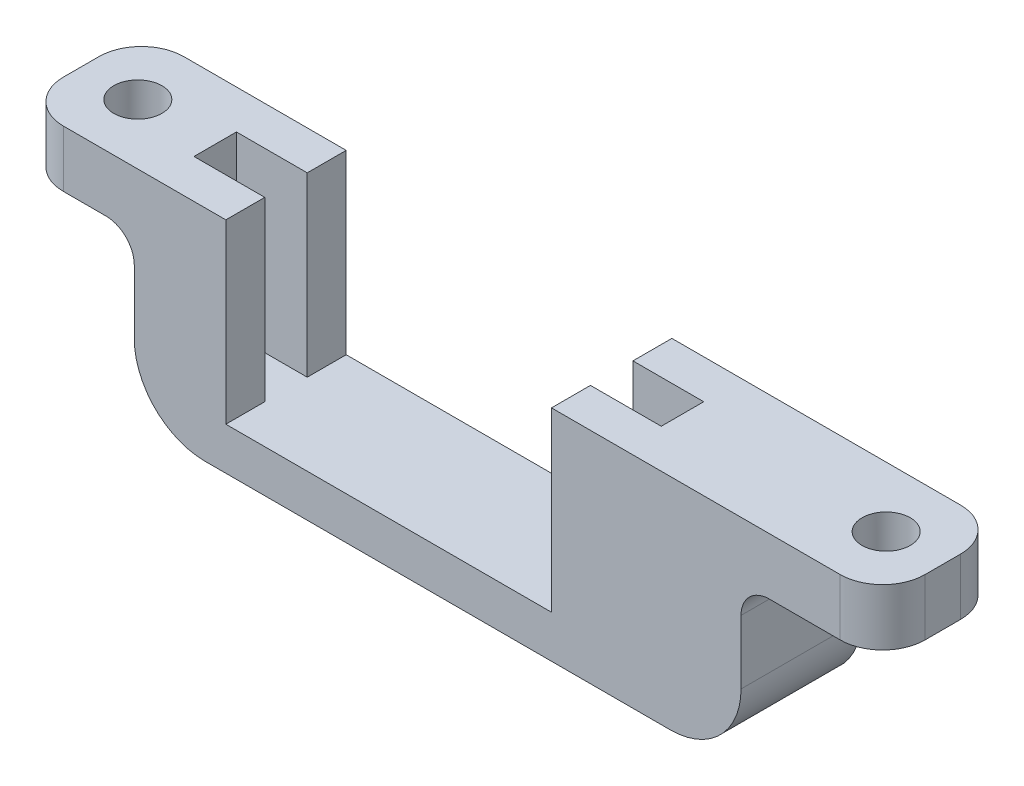
ISO-10303-21;
HEADER;
FILE_DESCRIPTION(('STEP AP214'),'2;1');
FILE_NAME('part.step','',(''),(''),'','','');
FILE_SCHEMA(('AUTOMOTIVE_DESIGN { 1 0 10303 214 1 1 1 1 }'));
ENDSEC;
DATA;
#1=APPLICATION_CONTEXT('core data for automotive mechanical design processes');
#2=APPLICATION_PROTOCOL_DEFINITION('international standard','automotive_design',2000,#1);
#3=PRODUCT_CONTEXT('',#1,'mechanical');
#4=PRODUCT('Part','Part','',(#3));
#5=PRODUCT_RELATED_PRODUCT_CATEGORY('part','',(#4));
#6=PRODUCT_DEFINITION_FORMATION('','',#4);
#7=PRODUCT_DEFINITION_CONTEXT('part definition',#1,'design');
#8=PRODUCT_DEFINITION('design','',#6,#7);
#9=PRODUCT_DEFINITION_SHAPE('','',#8);
#10=(LENGTH_UNIT() NAMED_UNIT(*) SI_UNIT(.MILLI.,.METRE.));
#11=(NAMED_UNIT(*) PLANE_ANGLE_UNIT() SI_UNIT($,.RADIAN.));
#12=(NAMED_UNIT(*) SI_UNIT($,.STERADIAN.) SOLID_ANGLE_UNIT());
#13=UNCERTAINTY_MEASURE_WITH_UNIT(LENGTH_MEASURE(1.E-05),#10,'distance_accuracy_value','');
#14=(GEOMETRIC_REPRESENTATION_CONTEXT(3) GLOBAL_UNCERTAINTY_ASSIGNED_CONTEXT((#13)) GLOBAL_UNIT_ASSIGNED_CONTEXT((#10,
#11,#12)) REPRESENTATION_CONTEXT('',''));
#15=CARTESIAN_POINT('',(0.,0.,0.));
#16=DIRECTION('',(0.,0.,1.));
#17=DIRECTION('',(1.,0.,0.));
#18=AXIS2_PLACEMENT_3D('',#15,#16,#17);
#19=CARTESIAN_POINT('',(-30.425,15.5,-4.25));
#20=DIRECTION('',(1.,0.,0.));
#21=DIRECTION('',(0.,0.,-1.));
#22=AXIS2_PLACEMENT_3D('',#19,#20,#21);
#23=PLANE('',#22);
#24=DIRECTION('',(0.,0.,1.));
#25=VECTOR('',#24,1.);
#26=CARTESIAN_POINT('',(-30.425,15.5,-4.25));
#27=LINE('',#26,#25);
#28=CARTESIAN_POINT('',(-30.425,15.5,-1.25));
#29=VERTEX_POINT('',#28);
#30=CARTESIAN_POINT('',(-30.425,15.5,1.25));
#31=VERTEX_POINT('',#30);
#32=EDGE_CURVE('E281',#29,#31,#27,.T.);
#33=ORIENTED_EDGE('',*,*,#32,.F.);
#34=DIRECTION('',(0.,-1.,0.));
#35=VECTOR('',#34,1.);
#36=CARTESIAN_POINT('',(-30.425,15.5,-1.25));
#37=LINE('',#36,#35);
#38=CARTESIAN_POINT('',(-30.425,11.5,-1.25));
#39=VERTEX_POINT('',#38);
#40=EDGE_CURVE('E342',#29,#39,#37,.T.);
#41=ORIENTED_EDGE('',*,*,#40,.T.);
#42=DIRECTION('',(0.,0.,-1.));
#43=VECTOR('',#42,1.);
#44=CARTESIAN_POINT('',(-30.425,11.5,4.25));
#45=LINE('',#44,#43);
#46=CARTESIAN_POINT('',(-30.425,11.5,1.25));
#47=VERTEX_POINT('',#46);
#48=EDGE_CURVE('E402',#47,#39,#45,.T.);
#49=ORIENTED_EDGE('',*,*,#48,.F.);
#50=DIRECTION('',(0.,-1.,0.));
#51=VECTOR('',#50,1.);
#52=CARTESIAN_POINT('',(-30.425,15.5,1.25));
#53=LINE('',#52,#51);
#54=EDGE_CURVE('E340',#47,#31,#53,.F.);
#55=ORIENTED_EDGE('',*,*,#54,.T.);
#56=EDGE_LOOP('',(#33,#41,#49,#55));
#57=FACE_BOUND('',#56,.T.);
#58=ADVANCED_FACE('F43',(#57),#23,.F.);
#59=CARTESIAN_POINT('',(-26.425,0.,0.));
#60=DIRECTION('',(0.,1.,0.));
#61=DIRECTION('',(0.,0.,1.));
#62=AXIS2_PLACEMENT_3D('',#59,#60,#61);
#63=CYLINDRICAL_SURFACE('',#62,1.7);
#64=CARTESIAN_POINT('',(-26.425,15.5,0.));
#65=DIRECTION('',(0.,1.,0.));
#66=DIRECTION('',(0.,0.,1.));
#67=AXIS2_PLACEMENT_3D('',#64,#65,#66);
#68=CIRCLE('',#67,1.7);
#69=CARTESIAN_POINT('',(-26.425,15.5,1.7));
#70=VERTEX_POINT('',#69);
#71=EDGE_CURVE('E266',#70,#70,#68,.T.);
#72=ORIENTED_EDGE('',*,*,#71,.T.);
#73=EDGE_LOOP('',(#72));
#74=FACE_BOUND('',#73,.T.);
#75=CARTESIAN_POINT('',(-26.425,11.5,0.));
#76=DIRECTION('',(0.,-1.,0.));
#77=DIRECTION('',(0.,0.,-1.));
#78=AXIS2_PLACEMENT_3D('',#75,#76,#77);
#79=CIRCLE('',#78,1.7);
#80=CARTESIAN_POINT('',(-26.425,11.5,-1.7));
#81=VERTEX_POINT('',#80);
#82=EDGE_CURVE('E290',#81,#81,#79,.F.);
#83=ORIENTED_EDGE('',*,*,#82,.F.);
#84=EDGE_LOOP('',(#83));
#85=FACE_BOUND('',#84,.T.);
#86=ADVANCED_FACE('F547',(#74,#85),#63,.F.);
#87=CARTESIAN_POINT('',(-30.425,15.5,-4.25));
#88=DIRECTION('',(0.,0.,1.));
#89=DIRECTION('',(1.,0.,0.));
#90=AXIS2_PLACEMENT_3D('',#87,#88,#89);
#91=PLANE('',#90);
#92=DIRECTION('',(-1.,0.,0.));
#93=VECTOR('',#92,1.);
#94=CARTESIAN_POINT('',(-30.425,0.,-4.25));
#95=LINE('',#94,#93);
#96=CARTESIAN_POINT('',(15.425,0.,-4.25));
#97=VERTEX_POINT('',#96);
#98=CARTESIAN_POINT('',(-17.425,0.,-4.25));
#99=VERTEX_POINT('',#98);
#100=EDGE_CURVE('E269',#97,#99,#95,.T.);
#101=ORIENTED_EDGE('',*,*,#100,.T.);
#102=CARTESIAN_POINT('',(-17.425,5.,-4.25));
#103=DIRECTION('',(0.,0.,1.));
#104=DIRECTION('',(1.,0.,0.));
#105=AXIS2_PLACEMENT_3D('',#102,#103,#104);
#106=CIRCLE('',#105,5.);
#107=CARTESIAN_POINT('',(-22.425,5.,-4.25));
#108=VERTEX_POINT('',#107);
#109=EDGE_CURVE('E51',#99,#108,#106,.F.);
#110=ORIENTED_EDGE('',*,*,#109,.T.);
#111=DIRECTION('',(0.,-1.,0.));
#112=VECTOR('',#111,1.);
#113=CARTESIAN_POINT('',(-22.425,11.5,-4.25));
#114=LINE('',#113,#112);
#115=CARTESIAN_POINT('',(-22.425,9.5,-4.25));
#116=VERTEX_POINT('',#115);
#117=EDGE_CURVE('E368',#116,#108,#114,.T.);
#118=ORIENTED_EDGE('',*,*,#117,.F.);
#119=CARTESIAN_POINT('',(-24.425,9.5,-4.25));
#120=DIRECTION('',(0.,0.,1.));
#121=DIRECTION('',(1.,0.,0.));
#122=AXIS2_PLACEMENT_3D('',#119,#120,#121);
#123=CIRCLE('',#122,2.);
#124=CARTESIAN_POINT('',(-24.425,11.5,-4.25));
#125=VERTEX_POINT('',#124);
#126=EDGE_CURVE('E309',#116,#125,#123,.T.);
#127=ORIENTED_EDGE('',*,*,#126,.T.);
#128=DIRECTION('',(1.,0.,0.));
#129=VECTOR('',#128,1.);
#130=CARTESIAN_POINT('',(-30.425,11.5,-4.25));
#131=LINE('',#130,#129);
#132=CARTESIAN_POINT('',(-27.425,11.5,-4.25));
#133=VERTEX_POINT('',#132);
#134=EDGE_CURVE('E524',#133,#125,#131,.T.);
#135=ORIENTED_EDGE('',*,*,#134,.F.);
#136=DIRECTION('',(0.,-1.,0.));
#137=VECTOR('',#136,1.);
#138=CARTESIAN_POINT('',(-27.425,15.5,-4.25));
#139=LINE('',#138,#137);
#140=CARTESIAN_POINT('',(-27.425,15.5,-4.25));
#141=VERTEX_POINT('',#140);
#142=EDGE_CURVE('E317',#133,#141,#139,.F.);
#143=ORIENTED_EDGE('',*,*,#142,.T.);
#144=DIRECTION('',(-1.,0.,0.));
#145=VECTOR('',#144,1.);
#146=CARTESIAN_POINT('',(-30.425,15.5,-4.25));
#147=LINE('',#146,#145);
#148=CARTESIAN_POINT('',(-15.96,15.5,-4.25));
#149=VERTEX_POINT('',#148);
#150=EDGE_CURVE('E277',#149,#141,#147,.T.);
#151=ORIENTED_EDGE('',*,*,#150,.F.);
#152=DIRECTION('',(0.,1.,0.));
#153=VECTOR('',#152,1.);
#154=CARTESIAN_POINT('',(-15.96,3.,-4.25));
#155=LINE('',#154,#153);
#156=CARTESIAN_POINT('',(-15.96,3.,-4.25));
#157=VERTEX_POINT('',#156);
#158=EDGE_CURVE('E451',#157,#149,#155,.T.);
#159=ORIENTED_EDGE('',*,*,#158,.F.);
#160=DIRECTION('',(-1.,0.,0.));
#161=VECTOR('',#160,1.);
#162=CARTESIAN_POINT('',(0.,3.,-4.25));
#163=LINE('',#162,#161);
#164=CARTESIAN_POINT('',(7.04,3.,-4.25));
#165=VERTEX_POINT('',#164);
#166=EDGE_CURVE('E411',#165,#157,#163,.T.);
#167=ORIENTED_EDGE('',*,*,#166,.F.);
#168=DIRECTION('',(0.,1.,0.));
#169=VECTOR('',#168,1.);
#170=CARTESIAN_POINT('',(7.04,3.,-4.25));
#171=LINE('',#170,#169);
#172=CARTESIAN_POINT('',(7.04,15.5,-4.25));
#173=VERTEX_POINT('',#172);
#174=EDGE_CURVE('E453',#165,#173,#171,.T.);
#175=ORIENTED_EDGE('',*,*,#174,.T.);
#176=CARTESIAN_POINT('',(27.425,15.5,-4.25));
#177=VERTEX_POINT('',#176);
#178=EDGE_CURVE('E279',#177,#173,#147,.T.);
#179=ORIENTED_EDGE('',*,*,#178,.F.);
#180=DIRECTION('',(0.,-1.,0.));
#181=VECTOR('',#180,1.);
#182=CARTESIAN_POINT('',(27.425,15.5,-4.25));
#183=LINE('',#182,#181);
#184=CARTESIAN_POINT('',(27.425,11.5,-4.25));
#185=VERTEX_POINT('',#184);
#186=EDGE_CURVE('E319',#177,#185,#183,.T.);
#187=ORIENTED_EDGE('',*,*,#186,.T.);
#188=DIRECTION('',(1.,0.,0.));
#189=VECTOR('',#188,1.);
#190=CARTESIAN_POINT('',(30.425,11.5,-4.25));
#191=LINE('',#190,#189);
#192=CARTESIAN_POINT('',(22.425,11.5,-4.25));
#193=VERTEX_POINT('',#192);
#194=EDGE_CURVE('E390',#193,#185,#191,.T.);
#195=ORIENTED_EDGE('',*,*,#194,.F.);
#196=CARTESIAN_POINT('',(22.425,9.5,-4.25));
#197=DIRECTION('',(0.,0.,1.));
#198=DIRECTION('',(1.,0.,0.));
#199=AXIS2_PLACEMENT_3D('',#196,#197,#198);
#200=CIRCLE('',#199,2.);
#201=CARTESIAN_POINT('',(20.425,9.5,-4.25));
#202=VERTEX_POINT('',#201);
#203=EDGE_CURVE('E312',#193,#202,#200,.T.);
#204=ORIENTED_EDGE('',*,*,#203,.T.);
#205=DIRECTION('',(0.,-1.,0.));
#206=VECTOR('',#205,1.);
#207=CARTESIAN_POINT('',(20.425,11.5,-4.25));
#208=LINE('',#207,#206);
#209=CARTESIAN_POINT('',(20.425,5.,-4.25));
#210=VERTEX_POINT('',#209);
#211=EDGE_CURVE('E391',#202,#210,#208,.T.);
#212=ORIENTED_EDGE('',*,*,#211,.T.);
#213=CARTESIAN_POINT('',(15.425,5.,-4.25));
#214=DIRECTION('',(0.,0.,1.));
#215=DIRECTION('',(1.,0.,0.));
#216=AXIS2_PLACEMENT_3D('',#213,#214,#215);
#217=CIRCLE('',#216,5.);
#218=EDGE_CURVE('E58',#210,#97,#217,.F.);
#219=ORIENTED_EDGE('',*,*,#218,.T.);
#220=EDGE_LOOP('',(#101,#110,#118,#127,#135,#143,#151,#159,#167,#175,#179,#187,#195,#204,#212,#219));
#221=FACE_BOUND('',#220,.T.);
#222=ADVANCED_FACE('F367',(#221),#91,.F.);
#223=CARTESIAN_POINT('',(-30.425,15.5,4.25));
#224=DIRECTION('',(0.,0.,-1.));
#225=DIRECTION('',(-1.,0.,0.));
#226=AXIS2_PLACEMENT_3D('',#223,#224,#225);
#227=PLANE('',#226);
#228=DIRECTION('',(0.,-1.,0.));
#229=VECTOR('',#228,1.);
#230=CARTESIAN_POINT('',(-22.425,11.5,4.25));
#231=LINE('',#230,#229);
#232=CARTESIAN_POINT('',(-22.425,9.5,4.25));
#233=VERTEX_POINT('',#232);
#234=CARTESIAN_POINT('',(-22.425,5.,4.25));
#235=VERTEX_POINT('',#234);
#236=EDGE_CURVE('E294',#233,#235,#231,.T.);
#237=ORIENTED_EDGE('',*,*,#236,.T.);
#238=CARTESIAN_POINT('',(-17.425,5.,4.25));
#239=DIRECTION('',(0.,0.,-1.));
#240=DIRECTION('',(-1.,0.,0.));
#241=AXIS2_PLACEMENT_3D('',#238,#239,#240);
#242=CIRCLE('',#241,5.);
#243=CARTESIAN_POINT('',(-17.425,0.,4.25));
#244=VERTEX_POINT('',#243);
#245=EDGE_CURVE('E358',#235,#244,#242,.F.);
#246=ORIENTED_EDGE('',*,*,#245,.T.);
#247=DIRECTION('',(1.,0.,0.));
#248=VECTOR('',#247,1.);
#249=CARTESIAN_POINT('',(-30.425,0.,4.25));
#250=LINE('',#249,#248);
#251=CARTESIAN_POINT('',(15.425,0.,4.25));
#252=VERTEX_POINT('',#251);
#253=EDGE_CURVE('E278',#244,#252,#250,.T.);
#254=ORIENTED_EDGE('',*,*,#253,.T.);
#255=CARTESIAN_POINT('',(15.425,5.,4.25));
#256=DIRECTION('',(0.,0.,-1.));
#257=DIRECTION('',(-1.,0.,0.));
#258=AXIS2_PLACEMENT_3D('',#255,#256,#257);
#259=CIRCLE('',#258,5.);
#260=CARTESIAN_POINT('',(20.425,5.,4.25));
#261=VERTEX_POINT('',#260);
#262=EDGE_CURVE('E356',#252,#261,#259,.F.);
#263=ORIENTED_EDGE('',*,*,#262,.T.);
#264=DIRECTION('',(0.,-1.,0.));
#265=VECTOR('',#264,1.);
#266=CARTESIAN_POINT('',(20.425,11.5,4.25));
#267=LINE('',#266,#265);
#268=CARTESIAN_POINT('',(20.425,9.5,4.25));
#269=VERTEX_POINT('',#268);
#270=EDGE_CURVE('E383',#269,#261,#267,.T.);
#271=ORIENTED_EDGE('',*,*,#270,.F.);
#272=CARTESIAN_POINT('',(22.425,9.5,4.25));
#273=DIRECTION('',(0.,0.,-1.));
#274=DIRECTION('',(-1.,0.,0.));
#275=AXIS2_PLACEMENT_3D('',#272,#273,#274);
#276=CIRCLE('',#275,2.);
#277=CARTESIAN_POINT('',(22.425,11.5,4.25));
#278=VERTEX_POINT('',#277);
#279=EDGE_CURVE('E314',#269,#278,#276,.T.);
#280=ORIENTED_EDGE('',*,*,#279,.T.);
#281=DIRECTION('',(-1.,0.,0.));
#282=VECTOR('',#281,1.);
#283=CARTESIAN_POINT('',(30.425,11.5,4.25));
#284=LINE('',#283,#282);
#285=CARTESIAN_POINT('',(27.425,11.5,4.25));
#286=VERTEX_POINT('',#285);
#287=EDGE_CURVE('E394',#286,#278,#284,.T.);
#288=ORIENTED_EDGE('',*,*,#287,.F.);
#289=DIRECTION('',(0.,-1.,0.));
#290=VECTOR('',#289,1.);
#291=CARTESIAN_POINT('',(27.425,15.5,4.25));
#292=LINE('',#291,#290);
#293=CARTESIAN_POINT('',(27.425,15.5,4.25));
#294=VERTEX_POINT('',#293);
#295=EDGE_CURVE('E338',#286,#294,#292,.F.);
#296=ORIENTED_EDGE('',*,*,#295,.T.);
#297=DIRECTION('',(1.,0.,0.));
#298=VECTOR('',#297,1.);
#299=CARTESIAN_POINT('',(-30.425,15.5,4.25));
#300=LINE('',#299,#298);
#301=CARTESIAN_POINT('',(7.04,15.5,4.25));
#302=VERTEX_POINT('',#301);
#303=EDGE_CURVE('E257',#302,#294,#300,.T.);
#304=ORIENTED_EDGE('',*,*,#303,.F.);
#305=DIRECTION('',(0.,1.,0.));
#306=VECTOR('',#305,1.);
#307=CARTESIAN_POINT('',(7.04,3.,4.25));
#308=LINE('',#307,#306);
#309=CARTESIAN_POINT('',(7.04,3.,4.25));
#310=VERTEX_POINT('',#309);
#311=EDGE_CURVE('E235',#310,#302,#308,.T.);
#312=ORIENTED_EDGE('',*,*,#311,.F.);
#313=DIRECTION('',(1.,0.,0.));
#314=VECTOR('',#313,1.);
#315=CARTESIAN_POINT('',(0.,3.,4.25));
#316=LINE('',#315,#314);
#317=CARTESIAN_POINT('',(-15.96,3.,4.25));
#318=VERTEX_POINT('',#317);
#319=EDGE_CURVE('E241',#318,#310,#316,.T.);
#320=ORIENTED_EDGE('',*,*,#319,.F.);
#321=DIRECTION('',(0.,1.,0.));
#322=VECTOR('',#321,1.);
#323=CARTESIAN_POINT('',(-15.96,3.,4.25));
#324=LINE('',#323,#322);
#325=CARTESIAN_POINT('',(-15.96,15.5,4.25));
#326=VERTEX_POINT('',#325);
#327=EDGE_CURVE('E273',#318,#326,#324,.T.);
#328=ORIENTED_EDGE('',*,*,#327,.T.);
#329=CARTESIAN_POINT('',(-27.425,15.5,4.25));
#330=VERTEX_POINT('',#329);
#331=EDGE_CURVE('E284',#330,#326,#300,.T.);
#332=ORIENTED_EDGE('',*,*,#331,.F.);
#333=DIRECTION('',(0.,-1.,0.));
#334=VECTOR('',#333,1.);
#335=CARTESIAN_POINT('',(-27.425,15.5,4.25));
#336=LINE('',#335,#334);
#337=CARTESIAN_POINT('',(-27.425,11.5,4.25));
#338=VERTEX_POINT('',#337);
#339=EDGE_CURVE('E335',#330,#338,#336,.T.);
#340=ORIENTED_EDGE('',*,*,#339,.T.);
#341=DIRECTION('',(-1.,0.,0.));
#342=VECTOR('',#341,1.);
#343=CARTESIAN_POINT('',(-30.425,11.5,4.25));
#344=LINE('',#343,#342);
#345=CARTESIAN_POINT('',(-24.425,11.5,4.25));
#346=VERTEX_POINT('',#345);
#347=EDGE_CURVE('E376',#346,#338,#344,.T.);
#348=ORIENTED_EDGE('',*,*,#347,.F.);
#349=CARTESIAN_POINT('',(-24.425,9.5,4.25));
#350=DIRECTION('',(0.,0.,-1.));
#351=DIRECTION('',(-1.,0.,0.));
#352=AXIS2_PLACEMENT_3D('',#349,#350,#351);
#353=CIRCLE('',#352,2.);
#354=EDGE_CURVE('E307',#346,#233,#353,.T.);
#355=ORIENTED_EDGE('',*,*,#354,.T.);
#356=EDGE_LOOP('',(#237,#246,#254,#263,#271,#280,#288,#296,#304,#312,#320,#328,#332,#340,#348,#355));
#357=FACE_BOUND('',#356,.T.);
#358=ADVANCED_FACE('F255',(#357),#227,.F.);
#359=CARTESIAN_POINT('',(0.,15.5,0.));
#360=DIRECTION('',(0.,1.,0.));
#361=DIRECTION('',(0.,0.,1.));
#362=AXIS2_PLACEMENT_3D('',#359,#360,#361);
#363=PLANE('',#362);
#364=ORIENTED_EDGE('',*,*,#71,.F.);
#365=EDGE_LOOP('',(#364));
#366=FACE_BOUND('',#365,.T.);
#367=ORIENTED_EDGE('',*,*,#150,.T.);
#368=CARTESIAN_POINT('',(-27.425,15.5,-1.25));
#369=DIRECTION('',(0.,1.,0.));
#370=DIRECTION('',(0.,0.,1.));
#371=AXIS2_PLACEMENT_3D('',#368,#369,#370);
#372=CIRCLE('',#371,3.);
#373=EDGE_CURVE('E351',#141,#29,#372,.T.);
#374=ORIENTED_EDGE('',*,*,#373,.T.);
#375=ORIENTED_EDGE('',*,*,#32,.T.);
#376=CARTESIAN_POINT('',(-27.425,15.5,1.25));
#377=DIRECTION('',(0.,1.,0.));
#378=DIRECTION('',(0.,0.,1.));
#379=AXIS2_PLACEMENT_3D('',#376,#377,#378);
#380=CIRCLE('',#379,3.);
#381=EDGE_CURVE('E349',#31,#330,#380,.T.);
#382=ORIENTED_EDGE('',*,*,#381,.T.);
#383=ORIENTED_EDGE('',*,*,#331,.T.);
#384=DIRECTION('',(0.,0.,-1.));
#385=VECTOR('',#384,1.);
#386=CARTESIAN_POINT('',(-15.96,15.5,0.));
#387=LINE('',#386,#385);
#388=CARTESIAN_POINT('',(-15.96,15.5,1.5));
#389=VERTEX_POINT('',#388);
#390=EDGE_CURVE('E251',#326,#389,#387,.T.);
#391=ORIENTED_EDGE('',*,*,#390,.T.);
#392=DIRECTION('',(1.,0.,0.));
#393=VECTOR('',#392,1.);
#394=CARTESIAN_POINT('',(0.,15.5,1.5));
#395=LINE('',#394,#393);
#396=CARTESIAN_POINT('',(-20.96,15.5,1.5));
#397=VERTEX_POINT('',#396);
#398=EDGE_CURVE('E439',#397,#389,#395,.T.);
#399=ORIENTED_EDGE('',*,*,#398,.F.);
#400=DIRECTION('',(0.,0.,-1.));
#401=VECTOR('',#400,1.);
#402=CARTESIAN_POINT('',(-20.96,15.5,0.));
#403=LINE('',#402,#401);
#404=CARTESIAN_POINT('',(-20.96,15.5,-1.5));
#405=VERTEX_POINT('',#404);
#406=EDGE_CURVE('E436',#397,#405,#403,.T.);
#407=ORIENTED_EDGE('',*,*,#406,.T.);
#408=DIRECTION('',(1.,0.,0.));
#409=VECTOR('',#408,1.);
#410=CARTESIAN_POINT('',(0.,15.5,-1.5));
#411=LINE('',#410,#409);
#412=CARTESIAN_POINT('',(-15.96,15.5,-1.5));
#413=VERTEX_POINT('',#412);
#414=EDGE_CURVE('E433',#405,#413,#411,.T.);
#415=ORIENTED_EDGE('',*,*,#414,.T.);
#416=EDGE_CURVE('E430',#413,#149,#387,.T.);
#417=ORIENTED_EDGE('',*,*,#416,.T.);
#418=EDGE_LOOP('',(#367,#374,#375,#382,#383,#391,#399,#407,#415,#417));
#419=FACE_BOUND('',#418,.T.);
#420=ADVANCED_FACE('F489',(#366,#419),#363,.T.);
#421=CARTESIAN_POINT('',(30.425,15.5,-4.25));
#422=DIRECTION('',(-1.,0.,0.));
#423=DIRECTION('',(0.,0.,1.));
#424=AXIS2_PLACEMENT_3D('',#421,#422,#423);
#425=PLANE('',#424);
#426=DIRECTION('',(0.,0.,1.));
#427=VECTOR('',#426,1.);
#428=CARTESIAN_POINT('',(30.425,11.5,4.25));
#429=LINE('',#428,#427);
#430=CARTESIAN_POINT('',(30.425,11.5,-1.25));
#431=VERTEX_POINT('',#430);
#432=CARTESIAN_POINT('',(30.425,11.5,1.25));
#433=VERTEX_POINT('',#432);
#434=EDGE_CURVE('E400',#431,#433,#429,.T.);
#435=ORIENTED_EDGE('',*,*,#434,.F.);
#436=DIRECTION('',(0.,-1.,0.));
#437=VECTOR('',#436,1.);
#438=CARTESIAN_POINT('',(30.425,15.5,-1.25));
#439=LINE('',#438,#437);
#440=CARTESIAN_POINT('',(30.425,15.5,-1.25));
#441=VERTEX_POINT('',#440);
#442=EDGE_CURVE('E329',#431,#441,#439,.F.);
#443=ORIENTED_EDGE('',*,*,#442,.T.);
#444=DIRECTION('',(0.,0.,-1.));
#445=VECTOR('',#444,1.);
#446=CARTESIAN_POINT('',(30.425,15.5,-4.25));
#447=LINE('',#446,#445);
#448=CARTESIAN_POINT('',(30.425,15.5,1.25));
#449=VERTEX_POINT('',#448);
#450=EDGE_CURVE('E274',#449,#441,#447,.T.);
#451=ORIENTED_EDGE('',*,*,#450,.F.);
#452=DIRECTION('',(0.,-1.,0.));
#453=VECTOR('',#452,1.);
#454=CARTESIAN_POINT('',(30.425,15.5,1.25));
#455=LINE('',#454,#453);
#456=EDGE_CURVE('E326',#449,#433,#455,.T.);
#457=ORIENTED_EDGE('',*,*,#456,.T.);
#458=EDGE_LOOP('',(#435,#443,#451,#457));
#459=FACE_BOUND('',#458,.T.);
#460=ADVANCED_FACE('F558',(#459),#425,.F.);
#461=ORIENTED_EDGE('',*,*,#450,.T.);
#462=CARTESIAN_POINT('',(27.425,15.5,-1.25));
#463=DIRECTION('',(0.,1.,0.));
#464=DIRECTION('',(0.,0.,1.));
#465=AXIS2_PLACEMENT_3D('',#462,#463,#464);
#466=CIRCLE('',#465,3.);
#467=EDGE_CURVE('E333',#441,#177,#466,.T.);
#468=ORIENTED_EDGE('',*,*,#467,.T.);
#469=ORIENTED_EDGE('',*,*,#178,.T.);
#470=DIRECTION('',(0.,0.,-1.));
#471=VECTOR('',#470,1.);
#472=CARTESIAN_POINT('',(7.04,15.5,0.));
#473=LINE('',#472,#471);
#474=CARTESIAN_POINT('',(7.04,15.5,-1.5));
#475=VERTEX_POINT('',#474);
#476=EDGE_CURVE('E421',#475,#173,#473,.T.);
#477=ORIENTED_EDGE('',*,*,#476,.F.);
#478=DIRECTION('',(-1.,0.,0.));
#479=VECTOR('',#478,1.);
#480=CARTESIAN_POINT('',(0.,15.5,-1.5));
#481=LINE('',#480,#479);
#482=CARTESIAN_POINT('',(12.04,15.5,-1.5));
#483=VERTEX_POINT('',#482);
#484=EDGE_CURVE('E427',#483,#475,#481,.T.);
#485=ORIENTED_EDGE('',*,*,#484,.F.);
#486=DIRECTION('',(0.,0.,-1.));
#487=VECTOR('',#486,1.);
#488=CARTESIAN_POINT('',(12.04,15.5,0.));
#489=LINE('',#488,#487);
#490=CARTESIAN_POINT('',(12.04,15.5,1.5));
#491=VERTEX_POINT('',#490);
#492=EDGE_CURVE('E424',#491,#483,#489,.T.);
#493=ORIENTED_EDGE('',*,*,#492,.F.);
#494=DIRECTION('',(-1.,0.,0.));
#495=VECTOR('',#494,1.);
#496=CARTESIAN_POINT('',(0.,15.5,1.5));
#497=LINE('',#496,#495);
#498=CARTESIAN_POINT('',(7.04,15.5,1.5));
#499=VERTEX_POINT('',#498);
#500=EDGE_CURVE('E420',#491,#499,#497,.T.);
#501=ORIENTED_EDGE('',*,*,#500,.T.);
#502=EDGE_CURVE('E297',#302,#499,#473,.T.);
#503=ORIENTED_EDGE('',*,*,#502,.F.);
#504=ORIENTED_EDGE('',*,*,#303,.T.);
#505=CARTESIAN_POINT('',(27.425,15.5,1.25));
#506=DIRECTION('',(0.,1.,0.));
#507=DIRECTION('',(0.,0.,1.));
#508=AXIS2_PLACEMENT_3D('',#505,#506,#507);
#509=CIRCLE('',#508,3.);
#510=EDGE_CURVE('E331',#294,#449,#509,.T.);
#511=ORIENTED_EDGE('',*,*,#510,.T.);
#512=EDGE_LOOP('',(#461,#468,#469,#477,#485,#493,#501,#503,#504,#511));
#513=FACE_BOUND('',#512,.T.);
#514=CARTESIAN_POINT('',(26.425,15.5,0.));
#515=DIRECTION('',(0.,1.,0.));
#516=DIRECTION('',(0.,0.,-1.));
#517=AXIS2_PLACEMENT_3D('',#514,#515,#516);
#518=CIRCLE('',#517,1.7);
#519=CARTESIAN_POINT('',(26.425,15.5,-1.7));
#520=VERTEX_POINT('',#519);
#521=EDGE_CURVE('E270',#520,#520,#518,.T.);
#522=ORIENTED_EDGE('',*,*,#521,.F.);
#523=EDGE_LOOP('',(#522));
#524=FACE_BOUND('',#523,.T.);
#525=ADVANCED_FACE('F468',(#513,#524),#363,.T.);
#526=CARTESIAN_POINT('',(0.,0.,0.));
#527=DIRECTION('',(0.,1.,0.));
#528=DIRECTION('',(0.,0.,1.));
#529=AXIS2_PLACEMENT_3D('',#526,#527,#528);
#530=PLANE('',#529);
#531=ORIENTED_EDGE('',*,*,#253,.F.);
#532=DIRECTION('',(0.,0.,1.));
#533=VECTOR('',#532,1.);
#534=CARTESIAN_POINT('',(-17.425,0.,0.));
#535=LINE('',#534,#533);
#536=EDGE_CURVE('E65',#244,#99,#535,.F.);
#537=ORIENTED_EDGE('',*,*,#536,.T.);
#538=ORIENTED_EDGE('',*,*,#100,.F.);
#539=DIRECTION('',(0.,0.,-1.));
#540=VECTOR('',#539,1.);
#541=CARTESIAN_POINT('',(15.425,0.,0.));
#542=LINE('',#541,#540);
#543=EDGE_CURVE('E360',#97,#252,#542,.F.);
#544=ORIENTED_EDGE('',*,*,#543,.T.);
#545=EDGE_LOOP('',(#531,#537,#538,#544));
#546=FACE_BOUND('',#545,.T.);
#547=ADVANCED_FACE('F380',(#546),#530,.F.);
#548=CARTESIAN_POINT('',(26.425,0.,0.));
#549=DIRECTION('',(0.,1.,0.));
#550=DIRECTION('',(0.,0.,1.));
#551=AXIS2_PLACEMENT_3D('',#548,#549,#550);
#552=CYLINDRICAL_SURFACE('',#551,1.7);
#553=CARTESIAN_POINT('',(26.425,11.5,0.));
#554=DIRECTION('',(0.,1.,0.));
#555=DIRECTION('',(0.,0.,1.));
#556=AXIS2_PLACEMENT_3D('',#553,#554,#555);
#557=CIRCLE('',#556,1.7);
#558=CARTESIAN_POINT('',(26.425,11.5,1.7));
#559=VERTEX_POINT('',#558);
#560=EDGE_CURVE('E293',#559,#559,#557,.F.);
#561=ORIENTED_EDGE('',*,*,#560,.T.);
#562=EDGE_LOOP('',(#561));
#563=FACE_BOUND('',#562,.T.);
#564=ORIENTED_EDGE('',*,*,#521,.T.);
#565=EDGE_LOOP('',(#564));
#566=FACE_BOUND('',#565,.T.);
#567=ADVANCED_FACE('F763',(#563,#566),#552,.F.);
#568=CARTESIAN_POINT('',(-15.96,3.,0.));
#569=DIRECTION('',(1.,0.,0.));
#570=DIRECTION('',(0.,0.,-1.));
#571=AXIS2_PLACEMENT_3D('',#568,#569,#570);
#572=PLANE('',#571);
#573=ORIENTED_EDGE('',*,*,#390,.F.);
#574=ORIENTED_EDGE('',*,*,#327,.F.);
#575=DIRECTION('',(0.,0.,-1.));
#576=VECTOR('',#575,1.);
#577=CARTESIAN_POINT('',(-15.96,3.,0.));
#578=LINE('',#577,#576);
#579=CARTESIAN_POINT('',(-15.96,3.,1.5));
#580=VERTEX_POINT('',#579);
#581=EDGE_CURVE('E248',#318,#580,#578,.T.);
#582=ORIENTED_EDGE('',*,*,#581,.T.);
#583=DIRECTION('',(0.,1.,0.));
#584=VECTOR('',#583,1.);
#585=CARTESIAN_POINT('',(-15.96,3.,1.5));
#586=LINE('',#585,#584);
#587=EDGE_CURVE('E443',#580,#389,#586,.T.);
#588=ORIENTED_EDGE('',*,*,#587,.T.);
#589=EDGE_LOOP('',(#573,#574,#582,#588));
#590=FACE_BOUND('',#589,.T.);
#591=ADVANCED_FACE('F507',(#590),#572,.T.);
#592=CARTESIAN_POINT('',(0.,3.,1.5));
#593=DIRECTION('',(0.,0.,1.));
#594=DIRECTION('',(1.,0.,0.));
#595=AXIS2_PLACEMENT_3D('',#592,#593,#594);
#596=PLANE('',#595);
#597=ORIENTED_EDGE('',*,*,#398,.T.);
#598=ORIENTED_EDGE('',*,*,#587,.F.);
#599=DIRECTION('',(1.,0.,0.));
#600=VECTOR('',#599,1.);
#601=CARTESIAN_POINT('',(0.,3.,1.5));
#602=LINE('',#601,#600);
#603=CARTESIAN_POINT('',(-20.96,3.,1.5));
#604=VERTEX_POINT('',#603);
#605=EDGE_CURVE('E261',#604,#580,#602,.T.);
#606=ORIENTED_EDGE('',*,*,#605,.F.);
#607=DIRECTION('',(0.,1.,0.));
#608=VECTOR('',#607,1.);
#609=CARTESIAN_POINT('',(-20.96,3.,1.5));
#610=LINE('',#609,#608);
#611=EDGE_CURVE('E445',#604,#397,#610,.T.);
#612=ORIENTED_EDGE('',*,*,#611,.T.);
#613=EDGE_LOOP('',(#597,#598,#606,#612));
#614=FACE_BOUND('',#613,.T.);
#615=ADVANCED_FACE('F503',(#614),#596,.F.);
#616=CARTESIAN_POINT('',(-20.96,3.,0.));
#617=DIRECTION('',(1.,0.,0.));
#618=DIRECTION('',(0.,0.,-1.));
#619=AXIS2_PLACEMENT_3D('',#616,#617,#618);
#620=PLANE('',#619);
#621=ORIENTED_EDGE('',*,*,#406,.F.);
#622=ORIENTED_EDGE('',*,*,#611,.F.);
#623=DIRECTION('',(0.,0.,-1.));
#624=VECTOR('',#623,1.);
#625=CARTESIAN_POINT('',(-20.96,3.,0.));
#626=LINE('',#625,#624);
#627=CARTESIAN_POINT('',(-20.96,3.,-1.5));
#628=VERTEX_POINT('',#627);
#629=EDGE_CURVE('E416',#604,#628,#626,.T.);
#630=ORIENTED_EDGE('',*,*,#629,.T.);
#631=DIRECTION('',(0.,1.,0.));
#632=VECTOR('',#631,1.);
#633=CARTESIAN_POINT('',(-20.96,3.,-1.5));
#634=LINE('',#633,#632);
#635=EDGE_CURVE('E447',#628,#405,#634,.T.);
#636=ORIENTED_EDGE('',*,*,#635,.T.);
#637=EDGE_LOOP('',(#621,#622,#630,#636));
#638=FACE_BOUND('',#637,.T.);
#639=ADVANCED_FACE('F738',(#638),#620,.T.);
#640=CARTESIAN_POINT('',(0.,3.,-1.5));
#641=DIRECTION('',(0.,0.,1.));
#642=DIRECTION('',(1.,0.,0.));
#643=AXIS2_PLACEMENT_3D('',#640,#641,#642);
#644=PLANE('',#643);
#645=ORIENTED_EDGE('',*,*,#414,.F.);
#646=ORIENTED_EDGE('',*,*,#635,.F.);
#647=DIRECTION('',(1.,0.,0.));
#648=VECTOR('',#647,1.);
#649=CARTESIAN_POINT('',(0.,3.,-1.5));
#650=LINE('',#649,#648);
#651=CARTESIAN_POINT('',(-15.96,3.,-1.5));
#652=VERTEX_POINT('',#651);
#653=EDGE_CURVE('E414',#628,#652,#650,.T.);
#654=ORIENTED_EDGE('',*,*,#653,.T.);
#655=DIRECTION('',(0.,1.,0.));
#656=VECTOR('',#655,1.);
#657=CARTESIAN_POINT('',(-15.96,3.,-1.5));
#658=LINE('',#657,#656);
#659=EDGE_CURVE('E449',#652,#413,#658,.T.);
#660=ORIENTED_EDGE('',*,*,#659,.T.);
#661=EDGE_LOOP('',(#645,#646,#654,#660));
#662=FACE_BOUND('',#661,.T.);
#663=ADVANCED_FACE('F496',(#662),#644,.T.);
#664=ORIENTED_EDGE('',*,*,#416,.F.);
#665=ORIENTED_EDGE('',*,*,#659,.F.);
#666=EDGE_CURVE('E263',#652,#157,#578,.T.);
#667=ORIENTED_EDGE('',*,*,#666,.T.);
#668=ORIENTED_EDGE('',*,*,#158,.T.);
#669=EDGE_LOOP('',(#664,#665,#667,#668));
#670=FACE_BOUND('',#669,.T.);
#671=ADVANCED_FACE('F486',(#670),#572,.T.);
#672=CARTESIAN_POINT('',(7.04,3.,0.));
#673=DIRECTION('',(1.,0.,0.));
#674=DIRECTION('',(0.,0.,-1.));
#675=AXIS2_PLACEMENT_3D('',#672,#673,#674);
#676=PLANE('',#675);
#677=ORIENTED_EDGE('',*,*,#476,.T.);
#678=ORIENTED_EDGE('',*,*,#174,.F.);
#679=DIRECTION('',(0.,0.,-1.));
#680=VECTOR('',#679,1.);
#681=CARTESIAN_POINT('',(7.04,3.,0.));
#682=LINE('',#681,#680);
#683=CARTESIAN_POINT('',(7.04,3.,-1.5));
#684=VERTEX_POINT('',#683);
#685=EDGE_CURVE('E243',#684,#165,#682,.T.);
#686=ORIENTED_EDGE('',*,*,#685,.F.);
#687=DIRECTION('',(0.,1.,0.));
#688=VECTOR('',#687,1.);
#689=CARTESIAN_POINT('',(7.04,3.,-1.5));
#690=LINE('',#689,#688);
#691=EDGE_CURVE('E456',#684,#475,#690,.T.);
#692=ORIENTED_EDGE('',*,*,#691,.T.);
#693=EDGE_LOOP('',(#677,#678,#686,#692));
#694=FACE_BOUND('',#693,.T.);
#695=ADVANCED_FACE('F691',(#694),#676,.F.);
#696=CARTESIAN_POINT('',(0.,3.,-1.5));
#697=DIRECTION('',(0.,0.,-1.));
#698=DIRECTION('',(-1.,0.,0.));
#699=AXIS2_PLACEMENT_3D('',#696,#697,#698);
#700=PLANE('',#699);
#701=ORIENTED_EDGE('',*,*,#484,.T.);
#702=ORIENTED_EDGE('',*,*,#691,.F.);
#703=DIRECTION('',(-1.,0.,0.));
#704=VECTOR('',#703,1.);
#705=CARTESIAN_POINT('',(0.,3.,-1.5));
#706=LINE('',#705,#704);
#707=CARTESIAN_POINT('',(12.04,3.,-1.5));
#708=VERTEX_POINT('',#707);
#709=EDGE_CURVE('E408',#708,#684,#706,.T.);
#710=ORIENTED_EDGE('',*,*,#709,.F.);
#711=DIRECTION('',(0.,1.,0.));
#712=VECTOR('',#711,1.);
#713=CARTESIAN_POINT('',(12.04,3.,-1.5));
#714=LINE('',#713,#712);
#715=EDGE_CURVE('E458',#708,#483,#714,.T.);
#716=ORIENTED_EDGE('',*,*,#715,.T.);
#717=EDGE_LOOP('',(#701,#702,#710,#716));
#718=FACE_BOUND('',#717,.T.);
#719=ADVANCED_FACE('F473',(#718),#700,.F.);
#720=CARTESIAN_POINT('',(12.04,3.,0.));
#721=DIRECTION('',(1.,0.,0.));
#722=DIRECTION('',(0.,0.,-1.));
#723=AXIS2_PLACEMENT_3D('',#720,#721,#722);
#724=PLANE('',#723);
#725=ORIENTED_EDGE('',*,*,#492,.T.);
#726=ORIENTED_EDGE('',*,*,#715,.F.);
#727=DIRECTION('',(0.,0.,-1.));
#728=VECTOR('',#727,1.);
#729=CARTESIAN_POINT('',(12.04,3.,0.));
#730=LINE('',#729,#728);
#731=CARTESIAN_POINT('',(12.04,3.,1.5));
#732=VERTEX_POINT('',#731);
#733=EDGE_CURVE('E405',#732,#708,#730,.T.);
#734=ORIENTED_EDGE('',*,*,#733,.F.);
#735=DIRECTION('',(0.,1.,0.));
#736=VECTOR('',#735,1.);
#737=CARTESIAN_POINT('',(12.04,3.,1.5));
#738=LINE('',#737,#736);
#739=EDGE_CURVE('E259',#732,#491,#738,.T.);
#740=ORIENTED_EDGE('',*,*,#739,.T.);
#741=EDGE_LOOP('',(#725,#726,#734,#740));
#742=FACE_BOUND('',#741,.T.);
#743=ADVANCED_FACE('F462',(#742),#724,.F.);
#744=CARTESIAN_POINT('',(0.,3.,1.5));
#745=DIRECTION('',(0.,0.,-1.));
#746=DIRECTION('',(-1.,0.,0.));
#747=AXIS2_PLACEMENT_3D('',#744,#745,#746);
#748=PLANE('',#747);
#749=ORIENTED_EDGE('',*,*,#500,.F.);
#750=ORIENTED_EDGE('',*,*,#739,.F.);
#751=DIRECTION('',(-1.,0.,0.));
#752=VECTOR('',#751,1.);
#753=CARTESIAN_POINT('',(0.,3.,1.5));
#754=LINE('',#753,#752);
#755=CARTESIAN_POINT('',(7.04,3.,1.5));
#756=VERTEX_POINT('',#755);
#757=EDGE_CURVE('E240',#732,#756,#754,.T.);
#758=ORIENTED_EDGE('',*,*,#757,.T.);
#759=DIRECTION('',(0.,1.,0.));
#760=VECTOR('',#759,1.);
#761=CARTESIAN_POINT('',(7.04,3.,1.5));
#762=LINE('',#761,#760);
#763=EDGE_CURVE('E237',#756,#499,#762,.T.);
#764=ORIENTED_EDGE('',*,*,#763,.T.);
#765=EDGE_LOOP('',(#749,#750,#758,#764));
#766=FACE_BOUND('',#765,.T.);
#767=ADVANCED_FACE('F466',(#766),#748,.T.);
#768=ORIENTED_EDGE('',*,*,#502,.T.);
#769=ORIENTED_EDGE('',*,*,#763,.F.);
#770=EDGE_CURVE('E230',#310,#756,#682,.T.);
#771=ORIENTED_EDGE('',*,*,#770,.F.);
#772=ORIENTED_EDGE('',*,*,#311,.T.);
#773=EDGE_LOOP('',(#768,#769,#771,#772));
#774=FACE_BOUND('',#773,.T.);
#775=ADVANCED_FACE('F233',(#774),#676,.F.);
#776=CARTESIAN_POINT('',(0.,3.,0.));
#777=DIRECTION('',(0.,1.,0.));
#778=DIRECTION('',(0.,0.,1.));
#779=AXIS2_PLACEMENT_3D('',#776,#777,#778);
#780=PLANE('',#779);
#781=ORIENTED_EDGE('',*,*,#319,.T.);
#782=ORIENTED_EDGE('',*,*,#770,.T.);
#783=ORIENTED_EDGE('',*,*,#757,.F.);
#784=ORIENTED_EDGE('',*,*,#733,.T.);
#785=ORIENTED_EDGE('',*,*,#709,.T.);
#786=ORIENTED_EDGE('',*,*,#685,.T.);
#787=ORIENTED_EDGE('',*,*,#166,.T.);
#788=ORIENTED_EDGE('',*,*,#666,.F.);
#789=ORIENTED_EDGE('',*,*,#653,.F.);
#790=ORIENTED_EDGE('',*,*,#629,.F.);
#791=ORIENTED_EDGE('',*,*,#605,.T.);
#792=ORIENTED_EDGE('',*,*,#581,.F.);
#793=EDGE_LOOP('',(#781,#782,#783,#784,#785,#786,#787,#788,#789,#790,#791,#792));
#794=FACE_BOUND('',#793,.T.);
#795=ADVANCED_FACE('F246',(#794),#780,.T.);
#796=CARTESIAN_POINT('',(0.,11.5,0.));
#797=DIRECTION('',(0.,-1.,0.));
#798=DIRECTION('',(0.,0.,-1.));
#799=AXIS2_PLACEMENT_3D('',#796,#797,#798);
#800=PLANE('',#799);
#801=ORIENTED_EDGE('',*,*,#48,.T.);
#802=CARTESIAN_POINT('',(-27.425,11.5,-1.25));
#803=DIRECTION('',(0.,-1.,0.));
#804=DIRECTION('',(0.,0.,-1.));
#805=AXIS2_PLACEMENT_3D('',#802,#803,#804);
#806=CIRCLE('',#805,3.);
#807=EDGE_CURVE('E347',#39,#133,#806,.T.);
#808=ORIENTED_EDGE('',*,*,#807,.T.);
#809=ORIENTED_EDGE('',*,*,#134,.T.);
#810=DIRECTION('',(0.,0.,1.));
#811=VECTOR('',#810,1.);
#812=CARTESIAN_POINT('',(-24.425,11.5,0.));
#813=LINE('',#812,#811);
#814=EDGE_CURVE('E286',#125,#346,#813,.T.);
#815=ORIENTED_EDGE('',*,*,#814,.T.);
#816=ORIENTED_EDGE('',*,*,#347,.T.);
#817=CARTESIAN_POINT('',(-27.425,11.5,1.25));
#818=DIRECTION('',(0.,-1.,0.));
#819=DIRECTION('',(0.,0.,-1.));
#820=AXIS2_PLACEMENT_3D('',#817,#818,#819);
#821=CIRCLE('',#820,3.);
#822=EDGE_CURVE('E345',#338,#47,#821,.T.);
#823=ORIENTED_EDGE('',*,*,#822,.T.);
#824=EDGE_LOOP('',(#801,#808,#809,#815,#816,#823));
#825=FACE_BOUND('',#824,.T.);
#826=ORIENTED_EDGE('',*,*,#82,.T.);
#827=EDGE_LOOP('',(#826));
#828=FACE_BOUND('',#827,.T.);
#829=ADVANCED_FACE('F519',(#825,#828),#800,.T.);
#830=CARTESIAN_POINT('',(-22.425,11.5,4.25));
#831=DIRECTION('',(1.,0.,0.));
#832=DIRECTION('',(0.,0.,-1.));
#833=AXIS2_PLACEMENT_3D('',#830,#831,#832);
#834=PLANE('',#833);
#835=ORIENTED_EDGE('',*,*,#117,.T.);
#836=DIRECTION('',(0.,0.,1.));
#837=VECTOR('',#836,1.);
#838=CARTESIAN_POINT('',(-22.425,5.,4.25));
#839=LINE('',#838,#837);
#840=EDGE_CURVE('E353',#108,#235,#839,.T.);
#841=ORIENTED_EDGE('',*,*,#840,.T.);
#842=ORIENTED_EDGE('',*,*,#236,.F.);
#843=DIRECTION('',(0.,0.,1.));
#844=VECTOR('',#843,1.);
#845=CARTESIAN_POINT('',(-22.425,9.5,4.25));
#846=LINE('',#845,#844);
#847=EDGE_CURVE('E300',#233,#116,#846,.F.);
#848=ORIENTED_EDGE('',*,*,#847,.T.);
#849=EDGE_LOOP('',(#835,#841,#842,#848));
#850=FACE_BOUND('',#849,.T.);
#851=ADVANCED_FACE('F373',(#850),#834,.F.);
#852=CARTESIAN_POINT('',(0.,11.5,0.));
#853=DIRECTION('',(0.,1.,0.));
#854=DIRECTION('',(0.,0.,1.));
#855=AXIS2_PLACEMENT_3D('',#852,#853,#854);
#856=PLANE('',#855);
#857=ORIENTED_EDGE('',*,*,#194,.T.);
#858=CARTESIAN_POINT('',(27.425,11.5,-1.25));
#859=DIRECTION('',(0.,1.,0.));
#860=DIRECTION('',(0.,0.,1.));
#861=AXIS2_PLACEMENT_3D('',#858,#859,#860);
#862=CIRCLE('',#861,3.);
#863=EDGE_CURVE('E324',#185,#431,#862,.F.);
#864=ORIENTED_EDGE('',*,*,#863,.T.);
#865=ORIENTED_EDGE('',*,*,#434,.T.);
#866=CARTESIAN_POINT('',(27.425,11.5,1.25));
#867=DIRECTION('',(0.,1.,0.));
#868=DIRECTION('',(0.,0.,1.));
#869=AXIS2_PLACEMENT_3D('',#866,#867,#868);
#870=CIRCLE('',#869,3.);
#871=EDGE_CURVE('E322',#433,#286,#870,.F.);
#872=ORIENTED_EDGE('',*,*,#871,.T.);
#873=ORIENTED_EDGE('',*,*,#287,.T.);
#874=DIRECTION('',(0.,0.,-1.));
#875=VECTOR('',#874,1.);
#876=CARTESIAN_POINT('',(22.425,11.5,-4.25));
#877=LINE('',#876,#875);
#878=EDGE_CURVE('E302',#278,#193,#877,.T.);
#879=ORIENTED_EDGE('',*,*,#878,.T.);
#880=EDGE_LOOP('',(#857,#864,#865,#872,#873,#879));
#881=FACE_BOUND('',#880,.T.);
#882=ORIENTED_EDGE('',*,*,#560,.F.);
#883=EDGE_LOOP('',(#882));
#884=FACE_BOUND('',#883,.T.);
#885=ADVANCED_FACE('F543',(#881,#884),#856,.F.);
#886=CARTESIAN_POINT('',(20.425,11.5,4.25));
#887=DIRECTION('',(-1.,0.,0.));
#888=DIRECTION('',(0.,0.,1.));
#889=AXIS2_PLACEMENT_3D('',#886,#887,#888);
#890=PLANE('',#889);
#891=ORIENTED_EDGE('',*,*,#270,.T.);
#892=DIRECTION('',(0.,0.,-1.));
#893=VECTOR('',#892,1.);
#894=CARTESIAN_POINT('',(20.425,5.,4.25));
#895=LINE('',#894,#893);
#896=EDGE_CURVE('E11',#261,#210,#895,.T.);
#897=ORIENTED_EDGE('',*,*,#896,.T.);
#898=ORIENTED_EDGE('',*,*,#211,.F.);
#899=DIRECTION('',(0.,0.,-1.));
#900=VECTOR('',#899,1.);
#901=CARTESIAN_POINT('',(20.425,9.5,4.25));
#902=LINE('',#901,#900);
#903=EDGE_CURVE('E305',#202,#269,#902,.F.);
#904=ORIENTED_EDGE('',*,*,#903,.T.);
#905=EDGE_LOOP('',(#891,#897,#898,#904));
#906=FACE_BOUND('',#905,.T.);
#907=ADVANCED_FACE('F386',(#906),#890,.F.);
#908=CARTESIAN_POINT('',(-24.425,9.5,0.));
#909=DIRECTION('',(0.,0.,1.));
#910=DIRECTION('',(1.,0.,0.));
#911=AXIS2_PLACEMENT_3D('',#908,#909,#910);
#912=CYLINDRICAL_SURFACE('',#911,2.);
#913=ORIENTED_EDGE('',*,*,#126,.F.);
#914=ORIENTED_EDGE('',*,*,#847,.F.);
#915=ORIENTED_EDGE('',*,*,#354,.F.);
#916=ORIENTED_EDGE('',*,*,#814,.F.);
#917=EDGE_LOOP('',(#913,#914,#915,#916));
#918=FACE_BOUND('',#917,.T.);
#919=ADVANCED_FACE('F532',(#918),#912,.F.);
#920=CARTESIAN_POINT('',(22.425,9.5,0.));
#921=DIRECTION('',(0.,0.,1.));
#922=DIRECTION('',(1.,0.,0.));
#923=AXIS2_PLACEMENT_3D('',#920,#921,#922);
#924=CYLINDRICAL_SURFACE('',#923,2.);
#925=ORIENTED_EDGE('',*,*,#279,.F.);
#926=ORIENTED_EDGE('',*,*,#903,.F.);
#927=ORIENTED_EDGE('',*,*,#203,.F.);
#928=ORIENTED_EDGE('',*,*,#878,.F.);
#929=EDGE_LOOP('',(#925,#926,#927,#928));
#930=FACE_BOUND('',#929,.T.);
#931=ADVANCED_FACE('F534',(#930),#924,.F.);
#932=CARTESIAN_POINT('',(27.425,15.5,-1.25));
#933=DIRECTION('',(0.,-1.,0.));
#934=DIRECTION('',(0.,0.,-1.));
#935=AXIS2_PLACEMENT_3D('',#932,#933,#934);
#936=CYLINDRICAL_SURFACE('',#935,3.);
#937=ORIENTED_EDGE('',*,*,#467,.F.);
#938=ORIENTED_EDGE('',*,*,#442,.F.);
#939=ORIENTED_EDGE('',*,*,#863,.F.);
#940=ORIENTED_EDGE('',*,*,#186,.F.);
#941=EDGE_LOOP('',(#937,#938,#939,#940));
#942=FACE_BOUND('',#941,.T.);
#943=ADVANCED_FACE('F540',(#942),#936,.T.);
#944=CARTESIAN_POINT('',(27.425,15.5,1.25));
#945=DIRECTION('',(0.,-1.,0.));
#946=DIRECTION('',(0.,0.,-1.));
#947=AXIS2_PLACEMENT_3D('',#944,#945,#946);
#948=CYLINDRICAL_SURFACE('',#947,3.);
#949=ORIENTED_EDGE('',*,*,#510,.F.);
#950=ORIENTED_EDGE('',*,*,#295,.F.);
#951=ORIENTED_EDGE('',*,*,#871,.F.);
#952=ORIENTED_EDGE('',*,*,#456,.F.);
#953=EDGE_LOOP('',(#949,#950,#951,#952));
#954=FACE_BOUND('',#953,.T.);
#955=ADVANCED_FACE('F582',(#954),#948,.T.);
#956=CARTESIAN_POINT('',(-27.425,15.5,-1.25));
#957=DIRECTION('',(0.,-1.,0.));
#958=DIRECTION('',(0.,0.,-1.));
#959=AXIS2_PLACEMENT_3D('',#956,#957,#958);
#960=CYLINDRICAL_SURFACE('',#959,3.);
#961=ORIENTED_EDGE('',*,*,#373,.F.);
#962=ORIENTED_EDGE('',*,*,#142,.F.);
#963=ORIENTED_EDGE('',*,*,#807,.F.);
#964=ORIENTED_EDGE('',*,*,#40,.F.);
#965=EDGE_LOOP('',(#961,#962,#963,#964));
#966=FACE_BOUND('',#965,.T.);
#967=ADVANCED_FACE('F584',(#966),#960,.T.);
#968=CARTESIAN_POINT('',(-27.425,15.5,1.25));
#969=DIRECTION('',(0.,-1.,0.));
#970=DIRECTION('',(0.,0.,-1.));
#971=AXIS2_PLACEMENT_3D('',#968,#969,#970);
#972=CYLINDRICAL_SURFACE('',#971,3.);
#973=ORIENTED_EDGE('',*,*,#381,.F.);
#974=ORIENTED_EDGE('',*,*,#54,.F.);
#975=ORIENTED_EDGE('',*,*,#822,.F.);
#976=ORIENTED_EDGE('',*,*,#339,.F.);
#977=EDGE_LOOP('',(#973,#974,#975,#976));
#978=FACE_BOUND('',#977,.T.);
#979=ADVANCED_FACE('F514',(#978),#972,.T.);
#980=CARTESIAN_POINT('',(-17.425,5.,4.25));
#981=DIRECTION('',(0.,0.,1.));
#982=DIRECTION('',(1.,0.,0.));
#983=AXIS2_PLACEMENT_3D('',#980,#981,#982);
#984=CYLINDRICAL_SURFACE('',#983,5.);
#985=ORIENTED_EDGE('',*,*,#109,.F.);
#986=ORIENTED_EDGE('',*,*,#536,.F.);
#987=ORIENTED_EDGE('',*,*,#245,.F.);
#988=ORIENTED_EDGE('',*,*,#840,.F.);
#989=EDGE_LOOP('',(#985,#986,#987,#988));
#990=FACE_BOUND('',#989,.T.);
#991=ADVANCED_FACE('F378',(#990),#984,.T.);
#992=CARTESIAN_POINT('',(15.425,5.,4.25));
#993=DIRECTION('',(0.,0.,-1.));
#994=DIRECTION('',(-1.,0.,0.));
#995=AXIS2_PLACEMENT_3D('',#992,#993,#994);
#996=CYLINDRICAL_SURFACE('',#995,5.);
#997=ORIENTED_EDGE('',*,*,#262,.F.);
#998=ORIENTED_EDGE('',*,*,#543,.F.);
#999=ORIENTED_EDGE('',*,*,#218,.F.);
#1000=ORIENTED_EDGE('',*,*,#896,.F.);
#1001=EDGE_LOOP('',(#997,#998,#999,#1000));
#1002=FACE_BOUND('',#1001,.T.);
#1003=ADVANCED_FACE('F45',(#1002),#996,.T.);
#1004=CLOSED_SHELL('',(#58,#86,#222,#358,#420,#460,#525,#547,#567,#591,#615,#639,#663,#671,#695,
#719,#743,#767,#775,#795,#829,#851,#885,#907,#919,#931,#943,#955,#967,#979,#991,#1003));
#1005=MANIFOLD_SOLID_BREP('B2',#1004);
#1006=ADVANCED_BREP_SHAPE_REPRESENTATION('',(#18,#1005),#14);
#1007=SHAPE_DEFINITION_REPRESENTATION(#9,#1006);
ENDSEC;
END-ISO-10303-21;
